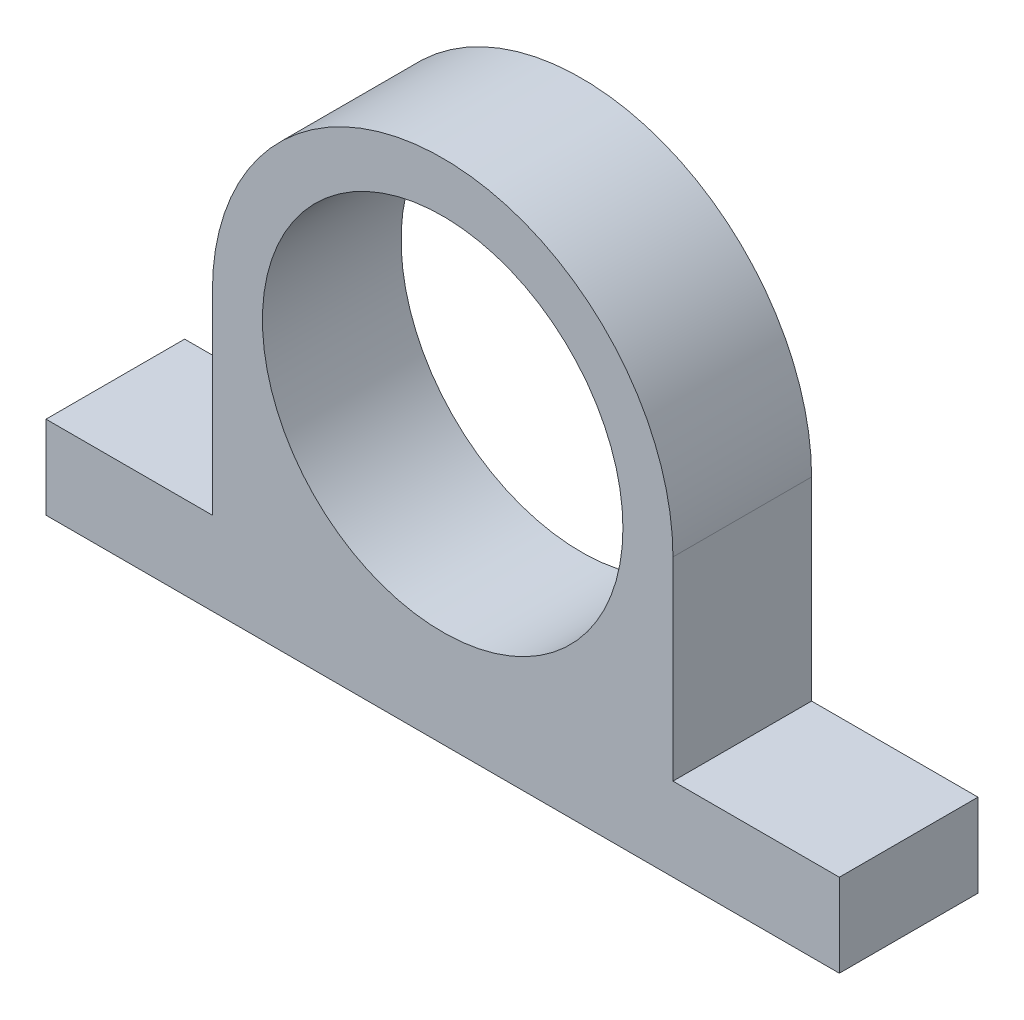
ISO-10303-21;
HEADER;
FILE_DESCRIPTION(('STEP AP214'),'2;1');
FILE_NAME('part.step','',(''),(''),'','','');
FILE_SCHEMA(('AUTOMOTIVE_DESIGN { 1 0 10303 214 1 1 1 1 }'));
ENDSEC;
DATA;
#1=APPLICATION_CONTEXT('core data for automotive mechanical design processes');
#2=APPLICATION_PROTOCOL_DEFINITION('international standard','automotive_design',2000,#1);
#3=PRODUCT_CONTEXT('',#1,'mechanical');
#4=PRODUCT('Part','Part','',(#3));
#5=PRODUCT_RELATED_PRODUCT_CATEGORY('part','',(#4));
#6=PRODUCT_DEFINITION_FORMATION('','',#4);
#7=PRODUCT_DEFINITION_CONTEXT('part definition',#1,'design');
#8=PRODUCT_DEFINITION('design','',#6,#7);
#9=PRODUCT_DEFINITION_SHAPE('','',#8);
#10=(LENGTH_UNIT() NAMED_UNIT(*) SI_UNIT(.MILLI.,.METRE.));
#11=(NAMED_UNIT(*) PLANE_ANGLE_UNIT() SI_UNIT($,.RADIAN.));
#12=(NAMED_UNIT(*) SI_UNIT($,.STERADIAN.) SOLID_ANGLE_UNIT());
#13=UNCERTAINTY_MEASURE_WITH_UNIT(LENGTH_MEASURE(1.E-05),#10,'distance_accuracy_value','');
#14=(GEOMETRIC_REPRESENTATION_CONTEXT(3) GLOBAL_UNCERTAINTY_ASSIGNED_CONTEXT((#13)) GLOBAL_UNIT_ASSIGNED_CONTEXT((#10,
#11,#12)) REPRESENTATION_CONTEXT('',''));
#15=CARTESIAN_POINT('',(0.,0.,0.));
#16=DIRECTION('',(0.,0.,1.));
#17=DIRECTION('',(1.,0.,0.));
#18=AXIS2_PLACEMENT_3D('',#15,#16,#17);
#19=CARTESIAN_POINT('',(-36.3492887796552,-28.048506758165,50.));
#20=DIRECTION('',(0.,0.,1.));
#21=DIRECTION('',(1.,0.,0.));
#22=AXIS2_PLACEMENT_3D('',#19,#20,#21);
#23=PLANE('',#22);
#24=CARTESIAN_POINT('',(-36.3492887796552,-28.048506758165,50.));
#25=DIRECTION('',(0.,0.,1.));
#26=DIRECTION('',(1.,0.,0.));
#27=AXIS2_PLACEMENT_3D('',#24,#25,#26);
#28=CIRCLE('',#27,83.0394645915329);
#29=CARTESIAN_POINT('',(46.6901758118777,-28.048506758165,50.));
#30=VERTEX_POINT('',#29);
#31=CARTESIAN_POINT('',(-119.388753371188,-28.048506758165,50.));
#32=VERTEX_POINT('',#31);
#33=EDGE_CURVE('E151',#30,#32,#28,.T.);
#34=ORIENTED_EDGE('',*,*,#33,.T.);
#35=DIRECTION('',(0.,-1.,0.));
#36=VECTOR('',#35,1.);
#37=CARTESIAN_POINT('',(-119.388753371188,-28.048506758165,50.));
#38=LINE('',#37,#36);
#39=CARTESIAN_POINT('',(-119.388753371188,-98.0485067581651,50.));
#40=VERTEX_POINT('',#39);
#41=EDGE_CURVE('E99',#32,#40,#38,.T.);
#42=ORIENTED_EDGE('',*,*,#41,.T.);
#43=DIRECTION('',(-1.,0.,0.));
#44=VECTOR('',#43,1.);
#45=CARTESIAN_POINT('',(-119.388753371188,-98.0485067581651,50.));
#46=LINE('',#45,#44);
#47=CARTESIAN_POINT('',(-179.388753371188,-98.0485067581651,50.));
#48=VERTEX_POINT('',#47);
#49=EDGE_CURVE('E166',#40,#48,#46,.T.);
#50=ORIENTED_EDGE('',*,*,#49,.T.);
#51=DIRECTION('',(0.,-1.,0.));
#52=VECTOR('',#51,1.);
#53=CARTESIAN_POINT('',(-179.388753371188,-98.0485067581651,50.));
#54=LINE('',#53,#52);
#55=CARTESIAN_POINT('',(-179.388753371188,-128.048506758165,50.));
#56=VERTEX_POINT('',#55);
#57=EDGE_CURVE('E179',#48,#56,#54,.T.);
#58=ORIENTED_EDGE('',*,*,#57,.T.);
#59=DIRECTION('',(1.,0.,0.));
#60=VECTOR('',#59,1.);
#61=CARTESIAN_POINT('',(-179.388753371188,-128.048506758165,50.));
#62=LINE('',#61,#60);
#63=CARTESIAN_POINT('',(106.690175811878,-128.048506758165,50.));
#64=VERTEX_POINT('',#63);
#65=EDGE_CURVE('E118',#56,#64,#62,.T.);
#66=ORIENTED_EDGE('',*,*,#65,.T.);
#67=DIRECTION('',(0.,1.,0.));
#68=VECTOR('',#67,1.);
#69=CARTESIAN_POINT('',(106.690175811878,-98.048506758165,50.));
#70=LINE('',#69,#68);
#71=CARTESIAN_POINT('',(106.690175811878,-98.048506758165,50.));
#72=VERTEX_POINT('',#71);
#73=EDGE_CURVE('E112',#64,#72,#70,.T.);
#74=ORIENTED_EDGE('',*,*,#73,.T.);
#75=DIRECTION('',(-1.,0.,0.));
#76=VECTOR('',#75,1.);
#77=CARTESIAN_POINT('',(46.6901758118777,-98.048506758165,50.));
#78=LINE('',#77,#76);
#79=CARTESIAN_POINT('',(46.6901758118777,-98.048506758165,50.));
#80=VERTEX_POINT('',#79);
#81=EDGE_CURVE('E116',#72,#80,#78,.T.);
#82=ORIENTED_EDGE('',*,*,#81,.T.);
#83=DIRECTION('',(0.,1.,0.));
#84=VECTOR('',#83,1.);
#85=CARTESIAN_POINT('',(46.6901758118777,-28.048506758165,50.));
#86=LINE('',#85,#84);
#87=EDGE_CURVE('E56',#80,#30,#86,.T.);
#88=ORIENTED_EDGE('',*,*,#87,.T.);
#89=EDGE_LOOP('',(#34,#42,#50,#58,#66,#74,#82,#88));
#90=FACE_BOUND('',#89,.T.);
#91=CARTESIAN_POINT('',(-36.3492887796552,-28.048506758165,50.));
#92=DIRECTION('',(0.,0.,1.));
#93=DIRECTION('',(1.,0.,0.));
#94=AXIS2_PLACEMENT_3D('',#91,#92,#93);
#95=CIRCLE('',#94,65.);
#96=CARTESIAN_POINT('',(28.6507112203448,-28.048506758165,50.));
#97=VERTEX_POINT('',#96);
#98=EDGE_CURVE('E140',#97,#97,#95,.T.);
#99=ORIENTED_EDGE('',*,*,#98,.F.);
#100=EDGE_LOOP('',(#99));
#101=FACE_BOUND('',#100,.T.);
#102=ADVANCED_FACE('F39',(#90,#101),#23,.T.);
#103=CARTESIAN_POINT('',(-36.3492887796552,-28.048506758165,0.));
#104=DIRECTION('',(0.,0.,1.));
#105=DIRECTION('',(1.,0.,0.));
#106=AXIS2_PLACEMENT_3D('',#103,#104,#105);
#107=PLANE('',#106);
#108=CARTESIAN_POINT('',(-36.3492887796552,-28.048506758165,0.));
#109=DIRECTION('',(0.,0.,1.));
#110=DIRECTION('',(1.,0.,0.));
#111=AXIS2_PLACEMENT_3D('',#108,#109,#110);
#112=CIRCLE('',#111,83.0394645915329);
#113=CARTESIAN_POINT('',(46.6901758118777,-28.048506758165,0.));
#114=VERTEX_POINT('',#113);
#115=CARTESIAN_POINT('',(-119.388753371188,-28.048506758165,0.));
#116=VERTEX_POINT('',#115);
#117=EDGE_CURVE('E136',#114,#116,#112,.T.);
#118=ORIENTED_EDGE('',*,*,#117,.F.);
#119=DIRECTION('',(0.,1.,0.));
#120=VECTOR('',#119,1.);
#121=CARTESIAN_POINT('',(46.6901758118777,-28.048506758165,0.));
#122=LINE('',#121,#120);
#123=CARTESIAN_POINT('',(46.6901758118777,-98.048506758165,0.));
#124=VERTEX_POINT('',#123);
#125=EDGE_CURVE('E91',#124,#114,#122,.T.);
#126=ORIENTED_EDGE('',*,*,#125,.F.);
#127=DIRECTION('',(-1.,0.,0.));
#128=VECTOR('',#127,1.);
#129=CARTESIAN_POINT('',(46.6901758118777,-98.048506758165,0.));
#130=LINE('',#129,#128);
#131=CARTESIAN_POINT('',(106.690175811878,-98.048506758165,0.));
#132=VERTEX_POINT('',#131);
#133=EDGE_CURVE('E85',#132,#124,#130,.T.);
#134=ORIENTED_EDGE('',*,*,#133,.F.);
#135=DIRECTION('',(0.,1.,0.));
#136=VECTOR('',#135,1.);
#137=CARTESIAN_POINT('',(106.690175811878,-98.048506758165,0.));
#138=LINE('',#137,#136);
#139=CARTESIAN_POINT('',(106.690175811878,-128.048506758165,0.));
#140=VERTEX_POINT('',#139);
#141=EDGE_CURVE('E126',#140,#132,#138,.T.);
#142=ORIENTED_EDGE('',*,*,#141,.F.);
#143=DIRECTION('',(1.,0.,0.));
#144=VECTOR('',#143,1.);
#145=CARTESIAN_POINT('',(-179.388753371188,-128.048506758165,0.));
#146=LINE('',#145,#144);
#147=CARTESIAN_POINT('',(-179.388753371188,-128.048506758165,0.));
#148=VERTEX_POINT('',#147);
#149=EDGE_CURVE('E146',#148,#140,#146,.T.);
#150=ORIENTED_EDGE('',*,*,#149,.F.);
#151=DIRECTION('',(0.,-1.,0.));
#152=VECTOR('',#151,1.);
#153=CARTESIAN_POINT('',(-179.388753371188,-98.0485067581651,0.));
#154=LINE('',#153,#152);
#155=CARTESIAN_POINT('',(-179.388753371188,-98.0485067581651,0.));
#156=VERTEX_POINT('',#155);
#157=EDGE_CURVE('E144',#156,#148,#154,.T.);
#158=ORIENTED_EDGE('',*,*,#157,.F.);
#159=DIRECTION('',(-1.,0.,0.));
#160=VECTOR('',#159,1.);
#161=CARTESIAN_POINT('',(-119.388753371188,-98.0485067581651,0.));
#162=LINE('',#161,#160);
#163=CARTESIAN_POINT('',(-119.388753371188,-98.0485067581651,0.));
#164=VERTEX_POINT('',#163);
#165=EDGE_CURVE('E142',#164,#156,#162,.T.);
#166=ORIENTED_EDGE('',*,*,#165,.F.);
#167=DIRECTION('',(0.,-1.,0.));
#168=VECTOR('',#167,1.);
#169=CARTESIAN_POINT('',(-119.388753371188,-28.048506758165,0.));
#170=LINE('',#169,#168);
#171=EDGE_CURVE('E139',#116,#164,#170,.T.);
#172=ORIENTED_EDGE('',*,*,#171,.F.);
#173=EDGE_LOOP('',(#118,#126,#134,#142,#150,#158,#166,#172));
#174=FACE_BOUND('',#173,.T.);
#175=CARTESIAN_POINT('',(-36.3492887796552,-28.048506758165,0.));
#176=DIRECTION('',(0.,0.,1.));
#177=DIRECTION('',(1.,0.,0.));
#178=AXIS2_PLACEMENT_3D('',#175,#176,#177);
#179=CIRCLE('',#178,65.);
#180=CARTESIAN_POINT('',(28.6507112203448,-28.048506758165,0.));
#181=VERTEX_POINT('',#180);
#182=EDGE_CURVE('E185',#181,#181,#179,.T.);
#183=ORIENTED_EDGE('',*,*,#182,.T.);
#184=EDGE_LOOP('',(#183));
#185=FACE_BOUND('',#184,.T.);
#186=ADVANCED_FACE('F170',(#174,#185),#107,.F.);
#187=CARTESIAN_POINT('',(-36.3492887796552,-28.048506758165,50.));
#188=DIRECTION('',(0.,0.,-1.));
#189=DIRECTION('',(-1.,0.,0.));
#190=AXIS2_PLACEMENT_3D('',#187,#188,#189);
#191=CYLINDRICAL_SURFACE('',#190,83.0394645915329);
#192=ORIENTED_EDGE('',*,*,#117,.T.);
#193=DIRECTION('',(0.,0.,-1.));
#194=VECTOR('',#193,1.);
#195=CARTESIAN_POINT('',(-119.388753371188,-28.048506758165,50.));
#196=LINE('',#195,#194);
#197=EDGE_CURVE('E11',#32,#116,#196,.T.);
#198=ORIENTED_EDGE('',*,*,#197,.F.);
#199=ORIENTED_EDGE('',*,*,#33,.F.);
#200=DIRECTION('',(0.,0.,-1.));
#201=VECTOR('',#200,1.);
#202=CARTESIAN_POINT('',(46.6901758118777,-28.048506758165,50.));
#203=LINE('',#202,#201);
#204=EDGE_CURVE('E132',#30,#114,#203,.T.);
#205=ORIENTED_EDGE('',*,*,#204,.T.);
#206=EDGE_LOOP('',(#192,#198,#199,#205));
#207=FACE_BOUND('',#206,.T.);
#208=ADVANCED_FACE('F41',(#207),#191,.T.);
#209=CARTESIAN_POINT('',(-119.388753371188,-28.048506758165,50.));
#210=DIRECTION('',(1.,0.,0.));
#211=DIRECTION('',(0.,0.,-1.));
#212=AXIS2_PLACEMENT_3D('',#209,#210,#211);
#213=PLANE('',#212);
#214=ORIENTED_EDGE('',*,*,#171,.T.);
#215=DIRECTION('',(0.,0.,-1.));
#216=VECTOR('',#215,1.);
#217=CARTESIAN_POINT('',(-119.388753371188,-98.0485067581651,50.));
#218=LINE('',#217,#216);
#219=EDGE_CURVE('E48',#40,#164,#218,.T.);
#220=ORIENTED_EDGE('',*,*,#219,.F.);
#221=ORIENTED_EDGE('',*,*,#41,.F.);
#222=ORIENTED_EDGE('',*,*,#197,.T.);
#223=EDGE_LOOP('',(#214,#220,#221,#222));
#224=FACE_BOUND('',#223,.T.);
#225=ADVANCED_FACE('F213',(#224),#213,.F.);
#226=CARTESIAN_POINT('',(-119.388753371188,-98.0485067581651,50.));
#227=DIRECTION('',(0.,-1.,0.));
#228=DIRECTION('',(0.,0.,-1.));
#229=AXIS2_PLACEMENT_3D('',#226,#227,#228);
#230=PLANE('',#229);
#231=ORIENTED_EDGE('',*,*,#165,.T.);
#232=DIRECTION('',(0.,0.,-1.));
#233=VECTOR('',#232,1.);
#234=CARTESIAN_POINT('',(-179.388753371188,-98.0485067581651,50.));
#235=LINE('',#234,#233);
#236=EDGE_CURVE('E158',#48,#156,#235,.T.);
#237=ORIENTED_EDGE('',*,*,#236,.F.);
#238=ORIENTED_EDGE('',*,*,#49,.F.);
#239=ORIENTED_EDGE('',*,*,#219,.T.);
#240=EDGE_LOOP('',(#231,#237,#238,#239));
#241=FACE_BOUND('',#240,.T.);
#242=ADVANCED_FACE('F164',(#241),#230,.F.);
#243=CARTESIAN_POINT('',(-179.388753371188,-98.0485067581651,50.));
#244=DIRECTION('',(1.,0.,0.));
#245=DIRECTION('',(0.,0.,-1.));
#246=AXIS2_PLACEMENT_3D('',#243,#244,#245);
#247=PLANE('',#246);
#248=ORIENTED_EDGE('',*,*,#157,.T.);
#249=DIRECTION('',(0.,0.,-1.));
#250=VECTOR('',#249,1.);
#251=CARTESIAN_POINT('',(-179.388753371188,-128.048506758165,50.));
#252=LINE('',#251,#250);
#253=EDGE_CURVE('E155',#56,#148,#252,.T.);
#254=ORIENTED_EDGE('',*,*,#253,.F.);
#255=ORIENTED_EDGE('',*,*,#57,.F.);
#256=ORIENTED_EDGE('',*,*,#236,.T.);
#257=EDGE_LOOP('',(#248,#254,#255,#256));
#258=FACE_BOUND('',#257,.T.);
#259=ADVANCED_FACE('F175',(#258),#247,.F.);
#260=CARTESIAN_POINT('',(-179.388753371188,-128.048506758165,50.));
#261=DIRECTION('',(0.,1.,0.));
#262=DIRECTION('',(-1.,0.,0.));
#263=AXIS2_PLACEMENT_3D('',#260,#261,#262);
#264=PLANE('',#263);
#265=ORIENTED_EDGE('',*,*,#149,.T.);
#266=DIRECTION('',(0.,0.,-1.));
#267=VECTOR('',#266,1.);
#268=CARTESIAN_POINT('',(106.690175811878,-128.048506758165,50.));
#269=LINE('',#268,#267);
#270=EDGE_CURVE('E127',#64,#140,#269,.T.);
#271=ORIENTED_EDGE('',*,*,#270,.F.);
#272=ORIENTED_EDGE('',*,*,#65,.F.);
#273=ORIENTED_EDGE('',*,*,#253,.T.);
#274=EDGE_LOOP('',(#265,#271,#272,#273));
#275=FACE_BOUND('',#274,.T.);
#276=ADVANCED_FACE('F178',(#275),#264,.F.);
#277=CARTESIAN_POINT('',(106.690175811878,-98.048506758165,50.));
#278=DIRECTION('',(-1.,0.,0.));
#279=DIRECTION('',(0.,-1.,0.));
#280=AXIS2_PLACEMENT_3D('',#277,#278,#279);
#281=PLANE('',#280);
#282=ORIENTED_EDGE('',*,*,#141,.T.);
#283=DIRECTION('',(0.,0.,-1.));
#284=VECTOR('',#283,1.);
#285=CARTESIAN_POINT('',(106.690175811878,-98.048506758165,50.));
#286=LINE('',#285,#284);
#287=EDGE_CURVE('E123',#72,#132,#286,.T.);
#288=ORIENTED_EDGE('',*,*,#287,.F.);
#289=ORIENTED_EDGE('',*,*,#73,.F.);
#290=ORIENTED_EDGE('',*,*,#270,.T.);
#291=EDGE_LOOP('',(#282,#288,#289,#290));
#292=FACE_BOUND('',#291,.T.);
#293=ADVANCED_FACE('F124',(#292),#281,.F.);
#294=CARTESIAN_POINT('',(46.6901758118777,-98.048506758165,50.));
#295=DIRECTION('',(0.,-1.,0.));
#296=DIRECTION('',(0.,0.,-1.));
#297=AXIS2_PLACEMENT_3D('',#294,#295,#296);
#298=PLANE('',#297);
#299=ORIENTED_EDGE('',*,*,#133,.T.);
#300=DIRECTION('',(0.,0.,-1.));
#301=VECTOR('',#300,1.);
#302=CARTESIAN_POINT('',(46.6901758118777,-98.048506758165,50.));
#303=LINE('',#302,#301);
#304=EDGE_CURVE('E128',#80,#124,#303,.T.);
#305=ORIENTED_EDGE('',*,*,#304,.F.);
#306=ORIENTED_EDGE('',*,*,#81,.F.);
#307=ORIENTED_EDGE('',*,*,#287,.T.);
#308=EDGE_LOOP('',(#299,#305,#306,#307));
#309=FACE_BOUND('',#308,.T.);
#310=ADVANCED_FACE('F130',(#309),#298,.F.);
#311=CARTESIAN_POINT('',(46.6901758118777,-28.048506758165,50.));
#312=DIRECTION('',(-1.,0.,0.));
#313=DIRECTION('',(0.,0.,1.));
#314=AXIS2_PLACEMENT_3D('',#311,#312,#313);
#315=PLANE('',#314);
#316=ORIENTED_EDGE('',*,*,#125,.T.);
#317=ORIENTED_EDGE('',*,*,#204,.F.);
#318=ORIENTED_EDGE('',*,*,#87,.F.);
#319=ORIENTED_EDGE('',*,*,#304,.T.);
#320=EDGE_LOOP('',(#316,#317,#318,#319));
#321=FACE_BOUND('',#320,.T.);
#322=ADVANCED_FACE('F201',(#321),#315,.F.);
#323=CARTESIAN_POINT('',(-36.3492887796552,-28.048506758165,50.));
#324=DIRECTION('',(0.,0.,-1.));
#325=DIRECTION('',(-1.,0.,0.));
#326=AXIS2_PLACEMENT_3D('',#323,#324,#325);
#327=CYLINDRICAL_SURFACE('',#326,65.);
#328=ORIENTED_EDGE('',*,*,#98,.T.);
#329=EDGE_LOOP('',(#328));
#330=FACE_BOUND('',#329,.T.);
#331=ORIENTED_EDGE('',*,*,#182,.F.);
#332=EDGE_LOOP('',(#331));
#333=FACE_BOUND('',#332,.T.);
#334=ADVANCED_FACE('F191',(#330,#333),#327,.F.);
#335=CLOSED_SHELL('',(#102,#186,#208,#225,#242,#259,#276,#293,#310,#322,#334));
#336=MANIFOLD_SOLID_BREP('B2',#335);
#337=ADVANCED_BREP_SHAPE_REPRESENTATION('',(#18,#336),#14);
#338=SHAPE_DEFINITION_REPRESENTATION(#9,#337);
ENDSEC;
END-ISO-10303-21;
